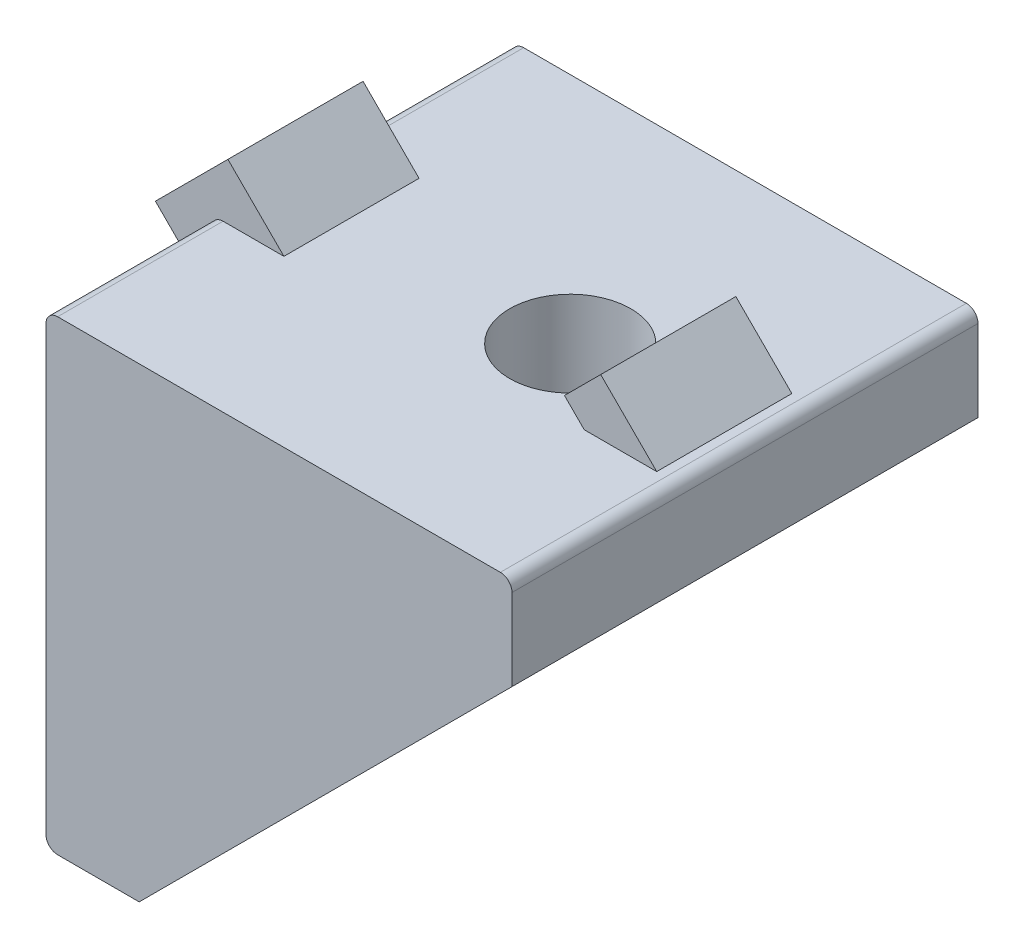
ISO-10303-21;
HEADER;
FILE_DESCRIPTION(('STEP AP214'),'2;1');
FILE_NAME('part.step','',(''),(''),'','','');
FILE_SCHEMA(('AUTOMOTIVE_DESIGN { 1 0 10303 214 1 1 1 1 }'));
ENDSEC;
DATA;
#1=APPLICATION_CONTEXT('core data for automotive mechanical design processes');
#2=APPLICATION_PROTOCOL_DEFINITION('international standard','automotive_design',2000,#1);
#3=PRODUCT_CONTEXT('',#1,'mechanical');
#4=PRODUCT('Part','Part','',(#3));
#5=PRODUCT_RELATED_PRODUCT_CATEGORY('part','',(#4));
#6=PRODUCT_DEFINITION_FORMATION('','',#4);
#7=PRODUCT_DEFINITION_CONTEXT('part definition',#1,'design');
#8=PRODUCT_DEFINITION('design','',#6,#7);
#9=PRODUCT_DEFINITION_SHAPE('','',#8);
#10=(LENGTH_UNIT() NAMED_UNIT(*) SI_UNIT(.MILLI.,.METRE.));
#11=(NAMED_UNIT(*) PLANE_ANGLE_UNIT() SI_UNIT($,.RADIAN.));
#12=(NAMED_UNIT(*) SI_UNIT($,.STERADIAN.) SOLID_ANGLE_UNIT());
#13=UNCERTAINTY_MEASURE_WITH_UNIT(LENGTH_MEASURE(1.E-05),#10,'distance_accuracy_value','');
#14=(GEOMETRIC_REPRESENTATION_CONTEXT(3) GLOBAL_UNCERTAINTY_ASSIGNED_CONTEXT((#13)) GLOBAL_UNIT_ASSIGNED_CONTEXT((#10,
#11,#12)) REPRESENTATION_CONTEXT('',''));
#15=CARTESIAN_POINT('',(0.,0.,0.));
#16=DIRECTION('',(0.,0.,1.));
#17=DIRECTION('',(1.,0.,0.));
#18=AXIS2_PLACEMENT_3D('',#15,#16,#17);
#19=CARTESIAN_POINT('',(-3.99999999999999,-16.,10.));
#20=DIRECTION('',(1.,0.,0.));
#21=DIRECTION('',(0.,1.,0.));
#22=AXIS2_PLACEMENT_3D('',#19,#20,#21);
#23=PLANE('',#22);
#24=DIRECTION('',(0.,-1.,0.));
#25=VECTOR('',#24,1.);
#26=CARTESIAN_POINT('',(-3.99999999999999,-16.,-10.));
#27=LINE('',#26,#25);
#28=CARTESIAN_POINT('',(-3.99999999999999,3.5,-10.));
#29=VERTEX_POINT('',#28);
#30=CARTESIAN_POINT('',(-3.99999999999999,-15.5,-10.));
#31=VERTEX_POINT('',#30);
#32=EDGE_CURVE('E366',#29,#31,#27,.T.);
#33=ORIENTED_EDGE('',*,*,#32,.T.);
#34=DIRECTION('',(0.,0.,-1.));
#35=VECTOR('',#34,1.);
#36=CARTESIAN_POINT('',(-3.99999999999999,-15.5,10.));
#37=LINE('',#36,#35);
#38=CARTESIAN_POINT('',(-3.99999999999999,-15.5,10.));
#39=VERTEX_POINT('',#38);
#40=EDGE_CURVE('E399',#31,#39,#37,.F.);
#41=ORIENTED_EDGE('',*,*,#40,.T.);
#42=DIRECTION('',(0.,-1.,0.));
#43=VECTOR('',#42,1.);
#44=CARTESIAN_POINT('',(-3.99999999999999,-16.,10.));
#45=LINE('',#44,#43);
#46=CARTESIAN_POINT('',(-3.99999999999999,3.5,10.));
#47=VERTEX_POINT('',#46);
#48=EDGE_CURVE('E355',#47,#39,#45,.T.);
#49=ORIENTED_EDGE('',*,*,#48,.F.);
#50=DIRECTION('',(0.,0.,-1.));
#51=VECTOR('',#50,1.);
#52=CARTESIAN_POINT('',(-3.99999999999999,3.5,10.));
#53=LINE('',#52,#51);
#54=CARTESIAN_POINT('',(-3.99999999999999,3.5,2.9));
#55=VERTEX_POINT('',#54);
#56=EDGE_CURVE('E393',#47,#55,#53,.T.);
#57=ORIENTED_EDGE('',*,*,#56,.T.);
#58=DIRECTION('',(0.,1.,0.));
#59=VECTOR('',#58,1.);
#60=CARTESIAN_POINT('',(-3.99999999999999,0.888730162779209,2.9));
#61=LINE('',#60,#59);
#62=CARTESIAN_POINT('',(-3.99999999999999,0.888730162779211,2.9));
#63=VERTEX_POINT('',#62);
#64=EDGE_CURVE('E295',#63,#55,#61,.T.);
#65=ORIENTED_EDGE('',*,*,#64,.F.);
#66=DIRECTION('',(0.,0.,-1.));
#67=VECTOR('',#66,1.);
#68=CARTESIAN_POINT('',(-3.99999999999999,0.888730162779209,2.9));
#69=LINE('',#68,#67);
#70=CARTESIAN_POINT('',(-3.99999999999999,0.888730162779209,-2.9));
#71=VERTEX_POINT('',#70);
#72=EDGE_CURVE('E298',#63,#71,#69,.T.);
#73=ORIENTED_EDGE('',*,*,#72,.T.);
#74=DIRECTION('',(0.,1.,0.));
#75=VECTOR('',#74,1.);
#76=CARTESIAN_POINT('',(-3.99999999999999,0.888730162779209,-2.9));
#77=LINE('',#76,#75);
#78=CARTESIAN_POINT('',(-3.99999999999999,3.5,-2.9));
#79=VERTEX_POINT('',#78);
#80=EDGE_CURVE('E288',#71,#79,#77,.T.);
#81=ORIENTED_EDGE('',*,*,#80,.T.);
#82=DIRECTION('',(0.,0.,-1.));
#83=VECTOR('',#82,1.);
#84=CARTESIAN_POINT('',(-3.99999999999999,3.5,10.));
#85=LINE('',#84,#83);
#86=EDGE_CURVE('E396',#79,#29,#85,.T.);
#87=ORIENTED_EDGE('',*,*,#86,.T.);
#88=EDGE_LOOP('',(#33,#41,#49,#57,#65,#73,#81,#87));
#89=FACE_BOUND('',#88,.T.);
#90=CARTESIAN_POINT('',(-3.99999999999999,-8.5,0.));
#91=DIRECTION('',(1.,0.,0.));
#92=DIRECTION('',(0.,0.,-1.));
#93=AXIS2_PLACEMENT_3D('',#90,#91,#92);
#94=CIRCLE('',#93,2.6);
#95=CARTESIAN_POINT('',(-3.99999999999999,-8.5,-2.6));
#96=VERTEX_POINT('',#95);
#97=EDGE_CURVE('E326',#96,#96,#94,.T.);
#98=ORIENTED_EDGE('',*,*,#97,.T.);
#99=EDGE_LOOP('',(#98));
#100=FACE_BOUND('',#99,.T.);
#101=DIRECTION('',(0.,1.,0.));
#102=VECTOR('',#101,1.);
#103=CARTESIAN_POINT('',(-3.99999999999999,-16.,2.9));
#104=LINE('',#103,#102);
#105=CARTESIAN_POINT('',(-3.99999999999999,-15.1112698372206,2.9));
#106=VERTEX_POINT('',#105);
#107=CARTESIAN_POINT('',(-3.99999999999999,-11.9999999999998,2.9));
#108=VERTEX_POINT('',#107);
#109=EDGE_CURVE('E254',#106,#108,#104,.T.);
#110=ORIENTED_EDGE('',*,*,#109,.F.);
#111=DIRECTION('',(0.,0.,1.));
#112=VECTOR('',#111,1.);
#113=CARTESIAN_POINT('',(-3.99999999999999,-15.1112698372206,10.));
#114=LINE('',#113,#112);
#115=CARTESIAN_POINT('',(-3.99999999999999,-15.1112698372206,-2.9));
#116=VERTEX_POINT('',#115);
#117=EDGE_CURVE('E233',#116,#106,#114,.T.);
#118=ORIENTED_EDGE('',*,*,#117,.F.);
#119=DIRECTION('',(0.,1.,0.));
#120=VECTOR('',#119,1.);
#121=CARTESIAN_POINT('',(-3.99999999999999,-16.,-2.9));
#122=LINE('',#121,#120);
#123=CARTESIAN_POINT('',(-3.99999999999999,-11.9999999999998,-2.9));
#124=VERTEX_POINT('',#123);
#125=EDGE_CURVE('E250',#116,#124,#122,.T.);
#126=ORIENTED_EDGE('',*,*,#125,.T.);
#127=DIRECTION('',(0.,0.,-1.));
#128=VECTOR('',#127,1.);
#129=CARTESIAN_POINT('',(-3.99999999999999,-11.9999999999998,10.));
#130=LINE('',#129,#128);
#131=EDGE_CURVE('E260',#108,#124,#130,.T.);
#132=ORIENTED_EDGE('',*,*,#131,.F.);
#133=EDGE_LOOP('',(#110,#118,#126,#132));
#134=FACE_BOUND('',#133,.T.);
#135=ADVANCED_FACE('F36',(#89,#100,#134),#23,.F.);
#136=CARTESIAN_POINT('',(-3.99999999999999,4.,10.));
#137=DIRECTION('',(0.,-1.,0.));
#138=DIRECTION('',(1.,0.,0.));
#139=AXIS2_PLACEMENT_3D('',#136,#137,#138);
#140=PLANE('',#139);
#141=DIRECTION('',(-1.,0.,0.));
#142=VECTOR('',#141,1.);
#143=CARTESIAN_POINT('',(-3.99999999999999,4.,10.));
#144=LINE('',#143,#142);
#145=CARTESIAN_POINT('',(15.5,4.,10.));
#146=VERTEX_POINT('',#145);
#147=CARTESIAN_POINT('',(-3.49999999999999,4.,10.));
#148=VERTEX_POINT('',#147);
#149=EDGE_CURVE('E351',#146,#148,#144,.T.);
#150=ORIENTED_EDGE('',*,*,#149,.F.);
#151=DIRECTION('',(0.,0.,-1.));
#152=VECTOR('',#151,1.);
#153=CARTESIAN_POINT('',(15.5,4.,10.));
#154=LINE('',#153,#152);
#155=CARTESIAN_POINT('',(15.5,4.,-10.));
#156=VERTEX_POINT('',#155);
#157=EDGE_CURVE('E411',#146,#156,#154,.T.);
#158=ORIENTED_EDGE('',*,*,#157,.T.);
#159=DIRECTION('',(-1.,0.,0.));
#160=VECTOR('',#159,1.);
#161=CARTESIAN_POINT('',(-3.99999999999999,4.,-10.));
#162=LINE('',#161,#160);
#163=CARTESIAN_POINT('',(-3.49999999999999,4.,-10.));
#164=VERTEX_POINT('',#163);
#165=EDGE_CURVE('E363',#156,#164,#162,.T.);
#166=ORIENTED_EDGE('',*,*,#165,.T.);
#167=DIRECTION('',(0.,0.,-1.));
#168=VECTOR('',#167,1.);
#169=CARTESIAN_POINT('',(-3.49999999999999,4.,10.));
#170=LINE('',#169,#168);
#171=CARTESIAN_POINT('',(-3.49999999999999,4.,-2.9));
#172=VERTEX_POINT('',#171);
#173=EDGE_CURVE('E409',#164,#172,#170,.F.);
#174=ORIENTED_EDGE('',*,*,#173,.T.);
#175=DIRECTION('',(1.,0.,0.));
#176=VECTOR('',#175,1.);
#177=CARTESIAN_POINT('',(-3.99999999999999,4.,-2.9));
#178=LINE('',#177,#176);
#179=CARTESIAN_POINT('',(-0.888730162779173,4.,-2.9));
#180=VERTEX_POINT('',#179);
#181=EDGE_CURVE('E284',#172,#180,#178,.T.);
#182=ORIENTED_EDGE('',*,*,#181,.T.);
#183=DIRECTION('',(0.,0.,-1.));
#184=VECTOR('',#183,1.);
#185=CARTESIAN_POINT('',(-0.888730162779173,4.,2.9));
#186=LINE('',#185,#184);
#187=CARTESIAN_POINT('',(-0.888730162779169,4.,2.9));
#188=VERTEX_POINT('',#187);
#189=EDGE_CURVE('E316',#188,#180,#186,.T.);
#190=ORIENTED_EDGE('',*,*,#189,.F.);
#191=DIRECTION('',(1.,0.,0.));
#192=VECTOR('',#191,1.);
#193=CARTESIAN_POINT('',(-3.99999999999999,4.,2.9));
#194=LINE('',#193,#192);
#195=CARTESIAN_POINT('',(-3.49999999999999,4.,2.9));
#196=VERTEX_POINT('',#195);
#197=EDGE_CURVE('E285',#196,#188,#194,.T.);
#198=ORIENTED_EDGE('',*,*,#197,.F.);
#199=DIRECTION('',(0.,0.,-1.));
#200=VECTOR('',#199,1.);
#201=CARTESIAN_POINT('',(-3.49999999999999,4.,10.));
#202=LINE('',#201,#200);
#203=EDGE_CURVE('E407',#196,#148,#202,.F.);
#204=ORIENTED_EDGE('',*,*,#203,.T.);
#205=EDGE_LOOP('',(#150,#158,#166,#174,#182,#190,#198,#204));
#206=FACE_BOUND('',#205,.T.);
#207=CARTESIAN_POINT('',(8.50000000000001,4.00000000000001,0.));
#208=DIRECTION('',(0.,-1.,0.));
#209=DIRECTION('',(1.,0.,0.));
#210=AXIS2_PLACEMENT_3D('',#207,#208,#209);
#211=CIRCLE('',#210,2.6);
#212=CARTESIAN_POINT('',(11.1,4.00000000000001,0.));
#213=VERTEX_POINT('',#212);
#214=EDGE_CURVE('E320',#213,#213,#211,.T.);
#215=ORIENTED_EDGE('',*,*,#214,.T.);
#216=EDGE_LOOP('',(#215));
#217=FACE_BOUND('',#216,.T.);
#218=DIRECTION('',(1.,0.,0.));
#219=VECTOR('',#218,1.);
#220=CARTESIAN_POINT('',(-3.99999999999999,4.,2.9));
#221=LINE('',#220,#219);
#222=CARTESIAN_POINT('',(12.,4.,2.9));
#223=VERTEX_POINT('',#222);
#224=CARTESIAN_POINT('',(15.1112698372208,4.00000000000001,2.9));
#225=VERTEX_POINT('',#224);
#226=EDGE_CURVE('E382',#223,#225,#221,.T.);
#227=ORIENTED_EDGE('',*,*,#226,.F.);
#228=DIRECTION('',(0.,0.,1.));
#229=VECTOR('',#228,1.);
#230=CARTESIAN_POINT('',(12.,4.,10.));
#231=LINE('',#230,#229);
#232=CARTESIAN_POINT('',(12.,4.,-2.9));
#233=VERTEX_POINT('',#232);
#234=EDGE_CURVE('E380',#233,#223,#231,.T.);
#235=ORIENTED_EDGE('',*,*,#234,.F.);
#236=DIRECTION('',(1.,0.,0.));
#237=VECTOR('',#236,1.);
#238=CARTESIAN_POINT('',(-3.99999999999999,4.,-2.9));
#239=LINE('',#238,#237);
#240=CARTESIAN_POINT('',(15.1112698372208,4.00000000000001,-2.9));
#241=VERTEX_POINT('',#240);
#242=EDGE_CURVE('E374',#233,#241,#239,.T.);
#243=ORIENTED_EDGE('',*,*,#242,.T.);
#244=DIRECTION('',(0.,0.,-1.));
#245=VECTOR('',#244,1.);
#246=CARTESIAN_POINT('',(15.1112698372208,4.,10.));
#247=LINE('',#246,#245);
#248=EDGE_CURVE('E377',#225,#241,#247,.T.);
#249=ORIENTED_EDGE('',*,*,#248,.F.);
#250=EDGE_LOOP('',(#227,#235,#243,#249));
#251=FACE_BOUND('',#250,.T.);
#252=ADVANCED_FACE('F479',(#206,#217,#251),#140,.F.);
#253=CARTESIAN_POINT('',(16.,0.,10.));
#254=DIRECTION('',(0.,1.,0.));
#255=DIRECTION('',(-1.,0.,0.));
#256=AXIS2_PLACEMENT_3D('',#253,#254,#255);
#257=PLANE('',#256);
#258=CARTESIAN_POINT('',(8.50000000000001,0.,0.));
#259=DIRECTION('',(0.,-1.,0.));
#260=DIRECTION('',(1.,0.,0.));
#261=AXIS2_PLACEMENT_3D('',#258,#259,#260);
#262=CIRCLE('',#261,2.6);
#263=CARTESIAN_POINT('',(11.1,0.,0.));
#264=VERTEX_POINT('',#263);
#265=EDGE_CURVE('E319',#264,#264,#262,.T.);
#266=ORIENTED_EDGE('',*,*,#265,.F.);
#267=EDGE_LOOP('',(#266));
#268=FACE_BOUND('',#267,.T.);
#269=DIRECTION('',(0.,0.,-1.));
#270=VECTOR('',#269,1.);
#271=CARTESIAN_POINT('',(16.,0.,10.));
#272=LINE('',#271,#270);
#273=CARTESIAN_POINT('',(16.,0.,6.00000000000001));
#274=VERTEX_POINT('',#273);
#275=CARTESIAN_POINT('',(16.,0.,-6.00000000000001));
#276=VERTEX_POINT('',#275);
#277=EDGE_CURVE('E372',#274,#276,#272,.T.);
#278=ORIENTED_EDGE('',*,*,#277,.F.);
#279=DIRECTION('',(-1.,0.,0.));
#280=VECTOR('',#279,1.);
#281=CARTESIAN_POINT('',(16.,0.,6.00000000000001));
#282=LINE('',#281,#280);
#283=CARTESIAN_POINT('',(0.999999999999994,0.,6.00000000000001));
#284=VERTEX_POINT('',#283);
#285=EDGE_CURVE('E441',#274,#284,#282,.T.);
#286=ORIENTED_EDGE('',*,*,#285,.T.);
#287=DIRECTION('',(0.,0.,-1.));
#288=VECTOR('',#287,1.);
#289=CARTESIAN_POINT('',(0.999999999999994,0.,-7.));
#290=LINE('',#289,#288);
#291=CARTESIAN_POINT('',(0.999999999999994,0.,-6.00000000000001));
#292=VERTEX_POINT('',#291);
#293=EDGE_CURVE('E439',#284,#292,#290,.T.);
#294=ORIENTED_EDGE('',*,*,#293,.T.);
#295=DIRECTION('',(1.,0.,0.));
#296=VECTOR('',#295,1.);
#297=CARTESIAN_POINT('',(16.,0.,-6.00000000000001));
#298=LINE('',#297,#296);
#299=EDGE_CURVE('E436',#292,#276,#298,.T.);
#300=ORIENTED_EDGE('',*,*,#299,.T.);
#301=EDGE_LOOP('',(#278,#286,#294,#300));
#302=FACE_BOUND('',#301,.T.);
#303=ADVANCED_FACE('F485',(#268,#302),#257,.F.);
#304=CARTESIAN_POINT('',(16.,4.,10.));
#305=DIRECTION('',(-1.,0.,0.));
#306=DIRECTION('',(0.,0.,1.));
#307=AXIS2_PLACEMENT_3D('',#304,#305,#306);
#308=PLANE('',#307);
#309=DIRECTION('',(0.,1.,0.));
#310=VECTOR('',#309,1.);
#311=CARTESIAN_POINT('',(16.,4.,-10.));
#312=LINE('',#311,#310);
#313=CARTESIAN_POINT('',(16.,0.,-10.));
#314=VERTEX_POINT('',#313);
#315=CARTESIAN_POINT('',(16.,3.5,-10.));
#316=VERTEX_POINT('',#315);
#317=EDGE_CURVE('E346',#314,#316,#312,.T.);
#318=ORIENTED_EDGE('',*,*,#317,.T.);
#319=DIRECTION('',(0.,0.,-1.));
#320=VECTOR('',#319,1.);
#321=CARTESIAN_POINT('',(16.,3.5,10.));
#322=LINE('',#321,#320);
#323=CARTESIAN_POINT('',(16.,3.5,10.));
#324=VERTEX_POINT('',#323);
#325=EDGE_CURVE('E414',#316,#324,#322,.F.);
#326=ORIENTED_EDGE('',*,*,#325,.T.);
#327=DIRECTION('',(0.,1.,0.));
#328=VECTOR('',#327,1.);
#329=CARTESIAN_POINT('',(16.,4.,10.));
#330=LINE('',#329,#328);
#331=CARTESIAN_POINT('',(16.,0.,10.));
#332=VERTEX_POINT('',#331);
#333=EDGE_CURVE('E348',#332,#324,#330,.T.);
#334=ORIENTED_EDGE('',*,*,#333,.F.);
#335=EDGE_CURVE('E54',#332,#274,#272,.T.);
#336=ORIENTED_EDGE('',*,*,#335,.T.);
#337=ORIENTED_EDGE('',*,*,#277,.T.);
#338=DIRECTION('',(0.,0.,-1.));
#339=VECTOR('',#338,1.);
#340=CARTESIAN_POINT('',(16.,0.,-7.));
#341=LINE('',#340,#339);
#342=EDGE_CURVE('E338',#276,#314,#341,.T.);
#343=ORIENTED_EDGE('',*,*,#342,.T.);
#344=EDGE_LOOP('',(#318,#326,#334,#336,#337,#343));
#345=FACE_BOUND('',#344,.T.);
#346=ADVANCED_FACE('F493',(#345),#308,.F.);
#347=CARTESIAN_POINT('',(0.,-16.,10.));
#348=DIRECTION('',(0.,1.,0.));
#349=DIRECTION('',(0.,0.,1.));
#350=AXIS2_PLACEMENT_3D('',#347,#348,#349);
#351=PLANE('',#350);
#352=DIRECTION('',(1.,0.,0.));
#353=VECTOR('',#352,1.);
#354=CARTESIAN_POINT('',(0.,-16.,10.));
#355=LINE('',#354,#353);
#356=CARTESIAN_POINT('',(-3.49999999999999,-16.,10.));
#357=VERTEX_POINT('',#356);
#358=CARTESIAN_POINT('',(0.,-16.,10.));
#359=VERTEX_POINT('',#358);
#360=EDGE_CURVE('E358',#357,#359,#355,.T.);
#361=ORIENTED_EDGE('',*,*,#360,.F.);
#362=DIRECTION('',(0.,0.,-1.));
#363=VECTOR('',#362,1.);
#364=CARTESIAN_POINT('',(-3.49999999999999,-16.,10.));
#365=LINE('',#364,#363);
#366=CARTESIAN_POINT('',(-3.49999999999999,-16.,-10.));
#367=VERTEX_POINT('',#366);
#368=EDGE_CURVE('E384',#357,#367,#365,.T.);
#369=ORIENTED_EDGE('',*,*,#368,.T.);
#370=DIRECTION('',(1.,0.,0.));
#371=VECTOR('',#370,1.);
#372=CARTESIAN_POINT('',(0.,-16.,-10.));
#373=LINE('',#372,#371);
#374=CARTESIAN_POINT('',(0.,-16.,-10.));
#375=VERTEX_POINT('',#374);
#376=EDGE_CURVE('E352',#367,#375,#373,.T.);
#377=ORIENTED_EDGE('',*,*,#376,.T.);
#378=DIRECTION('',(0.,0.,-1.));
#379=VECTOR('',#378,1.);
#380=CARTESIAN_POINT('',(0.,-16.,-7.));
#381=LINE('',#380,#379);
#382=CARTESIAN_POINT('',(0.,-16.,-6.00000000000001));
#383=VERTEX_POINT('',#382);
#384=EDGE_CURVE('E335',#383,#375,#381,.T.);
#385=ORIENTED_EDGE('',*,*,#384,.F.);
#386=DIRECTION('',(0.,0.,-1.));
#387=VECTOR('',#386,1.);
#388=CARTESIAN_POINT('',(0.,-16.,10.));
#389=LINE('',#388,#387);
#390=CARTESIAN_POINT('',(0.,-16.,6.));
#391=VERTEX_POINT('',#390);
#392=EDGE_CURVE('E360',#391,#383,#389,.T.);
#393=ORIENTED_EDGE('',*,*,#392,.F.);
#394=EDGE_CURVE('E370',#359,#391,#389,.T.);
#395=ORIENTED_EDGE('',*,*,#394,.F.);
#396=EDGE_LOOP('',(#361,#369,#377,#385,#393,#395));
#397=FACE_BOUND('',#396,.T.);
#398=ADVANCED_FACE('F490',(#397),#351,.F.);
#399=CARTESIAN_POINT('',(0.,0.,10.));
#400=DIRECTION('',(-1.,0.,0.));
#401=DIRECTION('',(0.,-1.,0.));
#402=AXIS2_PLACEMENT_3D('',#399,#400,#401);
#403=PLANE('',#402);
#404=ORIENTED_EDGE('',*,*,#392,.T.);
#405=DIRECTION('',(0.,1.,0.));
#406=VECTOR('',#405,1.);
#407=CARTESIAN_POINT('',(0.,0.,-6.00000000000001));
#408=LINE('',#407,#406);
#409=CARTESIAN_POINT('',(0.,-1.,-6.00000000000001));
#410=VERTEX_POINT('',#409);
#411=EDGE_CURVE('E430',#383,#410,#408,.T.);
#412=ORIENTED_EDGE('',*,*,#411,.T.);
#413=DIRECTION('',(0.,0.,1.));
#414=VECTOR('',#413,1.);
#415=CARTESIAN_POINT('',(0.,-1.,7.));
#416=LINE('',#415,#414);
#417=CARTESIAN_POINT('',(0.,-1.,6.));
#418=VERTEX_POINT('',#417);
#419=EDGE_CURVE('E425',#410,#418,#416,.T.);
#420=ORIENTED_EDGE('',*,*,#419,.T.);
#421=DIRECTION('',(0.,-1.,0.));
#422=VECTOR('',#421,1.);
#423=CARTESIAN_POINT('',(0.,0.,6.));
#424=LINE('',#423,#422);
#425=EDGE_CURVE('E427',#418,#391,#424,.T.);
#426=ORIENTED_EDGE('',*,*,#425,.T.);
#427=EDGE_LOOP('',(#404,#412,#420,#426));
#428=FACE_BOUND('',#427,.T.);
#429=CARTESIAN_POINT('',(0.,-8.5,0.));
#430=DIRECTION('',(1.,0.,0.));
#431=DIRECTION('',(0.,0.,-1.));
#432=AXIS2_PLACEMENT_3D('',#429,#430,#431);
#433=CIRCLE('',#432,2.6);
#434=CARTESIAN_POINT('',(0.,-8.5,-2.6));
#435=VERTEX_POINT('',#434);
#436=EDGE_CURVE('E323',#435,#435,#433,.T.);
#437=ORIENTED_EDGE('',*,*,#436,.F.);
#438=EDGE_LOOP('',(#437));
#439=FACE_BOUND('',#438,.T.);
#440=ADVANCED_FACE('F555',(#428,#439),#403,.F.);
#441=CARTESIAN_POINT('',(0.,0.,10.));
#442=DIRECTION('',(0.,0.,1.));
#443=DIRECTION('',(1.,0.,0.));
#444=AXIS2_PLACEMENT_3D('',#441,#442,#443);
#445=PLANE('',#444);
#446=ORIENTED_EDGE('',*,*,#48,.T.);
#447=CARTESIAN_POINT('',(-3.49999999999999,-15.5,10.));
#448=DIRECTION('',(0.,0.,1.));
#449=DIRECTION('',(1.,0.,0.));
#450=AXIS2_PLACEMENT_3D('',#447,#448,#449);
#451=CIRCLE('',#450,0.5);
#452=EDGE_CURVE('E405',#39,#357,#451,.T.);
#453=ORIENTED_EDGE('',*,*,#452,.T.);
#454=ORIENTED_EDGE('',*,*,#360,.T.);
#455=DIRECTION('',(0.707106781186548,0.707106781186548,0.));
#456=VECTOR('',#455,1.);
#457=CARTESIAN_POINT('',(0.,-16.,10.));
#458=LINE('',#457,#456);
#459=EDGE_CURVE('E340',#359,#332,#458,.T.);
#460=ORIENTED_EDGE('',*,*,#459,.T.);
#461=ORIENTED_EDGE('',*,*,#333,.T.);
#462=CARTESIAN_POINT('',(15.5,3.5,10.));
#463=DIRECTION('',(0.,0.,1.));
#464=DIRECTION('',(1.,0.,0.));
#465=AXIS2_PLACEMENT_3D('',#462,#463,#464);
#466=CIRCLE('',#465,0.5);
#467=EDGE_CURVE('E403',#324,#146,#466,.T.);
#468=ORIENTED_EDGE('',*,*,#467,.T.);
#469=ORIENTED_EDGE('',*,*,#149,.T.);
#470=CARTESIAN_POINT('',(-3.49999999999999,3.5,10.));
#471=DIRECTION('',(0.,0.,1.));
#472=DIRECTION('',(1.,0.,0.));
#473=AXIS2_PLACEMENT_3D('',#470,#471,#472);
#474=CIRCLE('',#473,0.5);
#475=EDGE_CURVE('E401',#148,#47,#474,.T.);
#476=ORIENTED_EDGE('',*,*,#475,.T.);
#477=EDGE_LOOP('',(#446,#453,#454,#460,#461,#468,#469,#476));
#478=FACE_BOUND('',#477,.T.);
#479=ADVANCED_FACE('F577',(#478),#445,.T.);
#480=CARTESIAN_POINT('',(0.,0.,-10.));
#481=DIRECTION('',(0.,0.,1.));
#482=DIRECTION('',(1.,0.,0.));
#483=AXIS2_PLACEMENT_3D('',#480,#481,#482);
#484=PLANE('',#483);
#485=ORIENTED_EDGE('',*,*,#376,.F.);
#486=CARTESIAN_POINT('',(-3.49999999999999,-15.5,-10.));
#487=DIRECTION('',(0.,0.,1.));
#488=DIRECTION('',(1.,0.,0.));
#489=AXIS2_PLACEMENT_3D('',#486,#487,#488);
#490=CIRCLE('',#489,0.5);
#491=EDGE_CURVE('E391',#367,#31,#490,.F.);
#492=ORIENTED_EDGE('',*,*,#491,.T.);
#493=ORIENTED_EDGE('',*,*,#32,.F.);
#494=CARTESIAN_POINT('',(-3.49999999999999,3.5,-10.));
#495=DIRECTION('',(0.,0.,1.));
#496=DIRECTION('',(1.,0.,0.));
#497=AXIS2_PLACEMENT_3D('',#494,#495,#496);
#498=CIRCLE('',#497,0.5);
#499=EDGE_CURVE('E387',#29,#164,#498,.F.);
#500=ORIENTED_EDGE('',*,*,#499,.T.);
#501=ORIENTED_EDGE('',*,*,#165,.F.);
#502=CARTESIAN_POINT('',(15.5,3.5,-10.));
#503=DIRECTION('',(0.,0.,1.));
#504=DIRECTION('',(1.,0.,0.));
#505=AXIS2_PLACEMENT_3D('',#502,#503,#504);
#506=CIRCLE('',#505,0.5);
#507=EDGE_CURVE('E389',#156,#316,#506,.F.);
#508=ORIENTED_EDGE('',*,*,#507,.T.);
#509=ORIENTED_EDGE('',*,*,#317,.F.);
#510=DIRECTION('',(0.707106781186548,0.707106781186548,0.));
#511=VECTOR('',#510,1.);
#512=CARTESIAN_POINT('',(0.,-16.,-10.));
#513=LINE('',#512,#511);
#514=EDGE_CURVE('E329',#375,#314,#513,.T.);
#515=ORIENTED_EDGE('',*,*,#514,.F.);
#516=EDGE_LOOP('',(#485,#492,#493,#500,#501,#508,#509,#515));
#517=FACE_BOUND('',#516,.T.);
#518=ADVANCED_FACE('F570',(#517),#484,.F.);
#519=CARTESIAN_POINT('',(0.,-16.,7.));
#520=DIRECTION('',(0.707106781186548,-0.707106781186547,0.));
#521=DIRECTION('',(0.707106781186547,0.707106781186548,0.));
#522=AXIS2_PLACEMENT_3D('',#519,#520,#521);
#523=PLANE('',#522);
#524=ORIENTED_EDGE('',*,*,#459,.F.);
#525=ORIENTED_EDGE('',*,*,#394,.T.);
#526=DIRECTION('',(0.577350269189624,0.577350269189624,0.57735026918963));
#527=VECTOR('',#526,1.);
#528=CARTESIAN_POINT('',(5.3333333333333,-10.6666666666667,11.3333333333333));
#529=LINE('',#528,#527);
#530=CARTESIAN_POINT('',(1.,-15.,7.));
#531=VERTEX_POINT('',#530);
#532=EDGE_CURVE('E446',#391,#531,#529,.T.);
#533=ORIENTED_EDGE('',*,*,#532,.T.);
#534=DIRECTION('',(0.707106781186548,0.707106781186548,0.));
#535=VECTOR('',#534,1.);
#536=CARTESIAN_POINT('',(0.,-16.,7.));
#537=LINE('',#536,#535);
#538=CARTESIAN_POINT('',(15.,-0.999999999999997,7.));
#539=VERTEX_POINT('',#538);
#540=EDGE_CURVE('E343',#531,#539,#537,.T.);
#541=ORIENTED_EDGE('',*,*,#540,.T.);
#542=DIRECTION('',(0.577350269189628,0.577350269189628,-0.577350269189622));
#543=VECTOR('',#542,1.);
#544=CARTESIAN_POINT('',(16.,0.,6.00000000000001));
#545=LINE('',#544,#543);
#546=EDGE_CURVE('E46',#539,#274,#545,.T.);
#547=ORIENTED_EDGE('',*,*,#546,.T.);
#548=ORIENTED_EDGE('',*,*,#335,.F.);
#549=EDGE_LOOP('',(#524,#525,#533,#541,#547,#548));
#550=FACE_BOUND('',#549,.T.);
#551=ADVANCED_FACE('F545',(#550),#523,.T.);
#552=CARTESIAN_POINT('',(0.,0.,7.));
#553=DIRECTION('',(0.,0.,-1.));
#554=DIRECTION('',(-1.,0.,0.));
#555=AXIS2_PLACEMENT_3D('',#552,#553,#554);
#556=PLANE('',#555);
#557=ORIENTED_EDGE('',*,*,#540,.F.);
#558=DIRECTION('',(0.,1.,0.));
#559=VECTOR('',#558,1.);
#560=CARTESIAN_POINT('',(0.999999999999994,0.,7.));
#561=LINE('',#560,#559);
#562=CARTESIAN_POINT('',(0.999999999999994,-1.,7.));
#563=VERTEX_POINT('',#562);
#564=EDGE_CURVE('E434',#531,#563,#561,.T.);
#565=ORIENTED_EDGE('',*,*,#564,.T.);
#566=DIRECTION('',(1.,0.,0.));
#567=VECTOR('',#566,1.);
#568=CARTESIAN_POINT('',(0.,-1.,7.));
#569=LINE('',#568,#567);
#570=EDGE_CURVE('E432',#563,#539,#569,.T.);
#571=ORIENTED_EDGE('',*,*,#570,.T.);
#572=EDGE_LOOP('',(#557,#565,#571));
#573=FACE_BOUND('',#572,.T.);
#574=ADVANCED_FACE('F550',(#573),#556,.T.);
#575=CARTESIAN_POINT('',(0.,-16.,-7.));
#576=DIRECTION('',(-0.707106781186548,0.707106781186547,0.));
#577=DIRECTION('',(-0.707106781186547,-0.707106781186548,0.));
#578=AXIS2_PLACEMENT_3D('',#575,#576,#577);
#579=PLANE('',#578);
#580=ORIENTED_EDGE('',*,*,#514,.T.);
#581=ORIENTED_EDGE('',*,*,#342,.F.);
#582=DIRECTION('',(-0.577350269189628,-0.577350269189628,-0.577350269189621));
#583=VECTOR('',#582,1.);
#584=CARTESIAN_POINT('',(4.99999999999993,-11.0000000000001,-17.));
#585=LINE('',#584,#583);
#586=CARTESIAN_POINT('',(15.,-0.999999999999997,-7.));
#587=VERTEX_POINT('',#586);
#588=EDGE_CURVE('E11',#276,#587,#585,.T.);
#589=ORIENTED_EDGE('',*,*,#588,.T.);
#590=DIRECTION('',(0.707106781186548,0.707106781186548,0.));
#591=VECTOR('',#590,1.);
#592=CARTESIAN_POINT('',(0.,-16.,-7.));
#593=LINE('',#592,#591);
#594=CARTESIAN_POINT('',(1.00000000000001,-15.,-7.));
#595=VERTEX_POINT('',#594);
#596=EDGE_CURVE('E332',#595,#587,#593,.T.);
#597=ORIENTED_EDGE('',*,*,#596,.F.);
#598=DIRECTION('',(-0.577350269189628,-0.577350269189628,0.577350269189622));
#599=VECTOR('',#598,1.);
#600=CARTESIAN_POINT('',(0.33333333333334,-15.6666666666667,-6.33333333333333));
#601=LINE('',#600,#599);
#602=EDGE_CURVE('E443',#595,#383,#601,.T.);
#603=ORIENTED_EDGE('',*,*,#602,.T.);
#604=ORIENTED_EDGE('',*,*,#384,.T.);
#605=EDGE_LOOP('',(#580,#581,#589,#597,#603,#604));
#606=FACE_BOUND('',#605,.T.);
#607=ADVANCED_FACE('F564',(#606),#579,.F.);
#608=CARTESIAN_POINT('',(0.,0.,-7.));
#609=DIRECTION('',(0.,0.,1.));
#610=DIRECTION('',(-1.,0.,0.));
#611=AXIS2_PLACEMENT_3D('',#608,#609,#610);
#612=PLANE('',#611);
#613=DIRECTION('',(-1.,0.,0.));
#614=VECTOR('',#613,1.);
#615=CARTESIAN_POINT('',(0.,-1.,-7.));
#616=LINE('',#615,#614);
#617=CARTESIAN_POINT('',(1.00000000000001,-1.,-7.));
#618=VERTEX_POINT('',#617);
#619=EDGE_CURVE('E420',#587,#618,#616,.T.);
#620=ORIENTED_EDGE('',*,*,#619,.T.);
#621=DIRECTION('',(0.,-1.,0.));
#622=VECTOR('',#621,1.);
#623=CARTESIAN_POINT('',(1.,0.,-7.));
#624=LINE('',#623,#622);
#625=EDGE_CURVE('E422',#618,#595,#624,.T.);
#626=ORIENTED_EDGE('',*,*,#625,.T.);
#627=ORIENTED_EDGE('',*,*,#596,.T.);
#628=EDGE_LOOP('',(#620,#626,#627));
#629=FACE_BOUND('',#628,.T.);
#630=ADVANCED_FACE('F636',(#629),#612,.T.);
#631=CARTESIAN_POINT('',(-3.99999999999999,-8.5,0.));
#632=DIRECTION('',(1.,0.,0.));
#633=DIRECTION('',(0.,0.,-1.));
#634=AXIS2_PLACEMENT_3D('',#631,#632,#633);
#635=CYLINDRICAL_SURFACE('',#634,2.6);
#636=ORIENTED_EDGE('',*,*,#97,.F.);
#637=EDGE_LOOP('',(#636));
#638=FACE_BOUND('',#637,.T.);
#639=ORIENTED_EDGE('',*,*,#436,.T.);
#640=EDGE_LOOP('',(#639));
#641=FACE_BOUND('',#640,.T.);
#642=ADVANCED_FACE('F632',(#638,#641),#635,.F.);
#643=CARTESIAN_POINT('',(8.50000000000001,4.00000000000001,0.));
#644=DIRECTION('',(0.,-1.,0.));
#645=DIRECTION('',(1.,0.,0.));
#646=AXIS2_PLACEMENT_3D('',#643,#644,#645);
#647=CYLINDRICAL_SURFACE('',#646,2.6);
#648=ORIENTED_EDGE('',*,*,#214,.F.);
#649=EDGE_LOOP('',(#648));
#650=FACE_BOUND('',#649,.T.);
#651=ORIENTED_EDGE('',*,*,#265,.T.);
#652=EDGE_LOOP('',(#651));
#653=FACE_BOUND('',#652,.T.);
#654=ADVANCED_FACE('F629',(#650,#653),#647,.F.);
#655=CARTESIAN_POINT('',(-0.888730162779173,4.,2.9));
#656=DIRECTION('',(-0.707106781186544,-0.707106781186552,0.));
#657=DIRECTION('',(0.707106781186552,-0.707106781186544,0.));
#658=AXIS2_PLACEMENT_3D('',#655,#656,#657);
#659=PLANE('',#658);
#660=DIRECTION('',(-0.707106781186552,0.707106781186544,0.));
#661=VECTOR('',#660,1.);
#662=CARTESIAN_POINT('',(-0.888730162779173,4.,-2.9));
#663=LINE('',#662,#661);
#664=CARTESIAN_POINT('',(-3.29289321881347,6.40416305603427,-2.9));
#665=VERTEX_POINT('',#664);
#666=EDGE_CURVE('E300',#180,#665,#663,.T.);
#667=ORIENTED_EDGE('',*,*,#666,.T.);
#668=DIRECTION('',(0.,0.,-1.));
#669=VECTOR('',#668,1.);
#670=CARTESIAN_POINT('',(-3.29289321881347,6.40416305603427,2.9));
#671=LINE('',#670,#669);
#672=CARTESIAN_POINT('',(-3.29289321881347,6.40416305603427,2.9));
#673=VERTEX_POINT('',#672);
#674=EDGE_CURVE('E313',#673,#665,#671,.T.);
#675=ORIENTED_EDGE('',*,*,#674,.F.);
#676=DIRECTION('',(-0.707106781186552,0.707106781186544,0.));
#677=VECTOR('',#676,1.);
#678=CARTESIAN_POINT('',(-0.888730162779173,4.,2.9));
#679=LINE('',#678,#677);
#680=EDGE_CURVE('E287',#188,#673,#679,.T.);
#681=ORIENTED_EDGE('',*,*,#680,.F.);
#682=ORIENTED_EDGE('',*,*,#189,.T.);
#683=EDGE_LOOP('',(#667,#675,#681,#682));
#684=FACE_BOUND('',#683,.T.);
#685=ADVANCED_FACE('F610',(#684),#659,.F.);
#686=CARTESIAN_POINT('',(-3.29289321881347,6.40416305603427,2.9));
#687=DIRECTION('',(0.707106781186552,-0.707106781186544,0.));
#688=DIRECTION('',(0.707106781186544,0.707106781186552,0.));
#689=AXIS2_PLACEMENT_3D('',#686,#687,#688);
#690=PLANE('',#689);
#691=DIRECTION('',(-0.707106781186544,-0.707106781186551,0.));
#692=VECTOR('',#691,1.);
#693=CARTESIAN_POINT('',(-3.29289321881347,6.40416305603427,-2.9));
#694=LINE('',#693,#692);
#695=CARTESIAN_POINT('',(-6.40416305603426,3.29289321881345,-2.9));
#696=VERTEX_POINT('',#695);
#697=EDGE_CURVE('E302',#665,#696,#694,.T.);
#698=ORIENTED_EDGE('',*,*,#697,.T.);
#699=DIRECTION('',(0.,0.,-1.));
#700=VECTOR('',#699,1.);
#701=CARTESIAN_POINT('',(-6.40416305603426,3.29289321881345,2.9));
#702=LINE('',#701,#700);
#703=CARTESIAN_POINT('',(-6.40416305603426,3.29289321881345,2.9));
#704=VERTEX_POINT('',#703);
#705=EDGE_CURVE('E310',#704,#696,#702,.T.);
#706=ORIENTED_EDGE('',*,*,#705,.F.);
#707=DIRECTION('',(-0.707106781186544,-0.707106781186551,0.));
#708=VECTOR('',#707,1.);
#709=CARTESIAN_POINT('',(-3.29289321881347,6.40416305603427,2.9));
#710=LINE('',#709,#708);
#711=EDGE_CURVE('E290',#673,#704,#710,.T.);
#712=ORIENTED_EDGE('',*,*,#711,.F.);
#713=ORIENTED_EDGE('',*,*,#674,.T.);
#714=EDGE_LOOP('',(#698,#706,#712,#713));
#715=FACE_BOUND('',#714,.T.);
#716=ADVANCED_FACE('F605',(#715),#690,.F.);
#717=CARTESIAN_POINT('',(-6.40416305603426,3.29289321881345,2.9));
#718=DIRECTION('',(0.707106781186544,0.707106781186551,0.));
#719=DIRECTION('',(-0.707106781186551,0.707106781186544,0.));
#720=AXIS2_PLACEMENT_3D('',#717,#718,#719);
#721=PLANE('',#720);
#722=DIRECTION('',(0.707106781186551,-0.707106781186544,0.));
#723=VECTOR('',#722,1.);
#724=CARTESIAN_POINT('',(-6.40416305603426,3.29289321881345,-2.9));
#725=LINE('',#724,#723);
#726=EDGE_CURVE('E304',#696,#71,#725,.T.);
#727=ORIENTED_EDGE('',*,*,#726,.T.);
#728=ORIENTED_EDGE('',*,*,#72,.F.);
#729=DIRECTION('',(0.707106781186551,-0.707106781186544,0.));
#730=VECTOR('',#729,1.);
#731=CARTESIAN_POINT('',(-6.40416305603426,3.29289321881345,2.9));
#732=LINE('',#731,#730);
#733=EDGE_CURVE('E292',#704,#63,#732,.T.);
#734=ORIENTED_EDGE('',*,*,#733,.F.);
#735=ORIENTED_EDGE('',*,*,#705,.T.);
#736=EDGE_LOOP('',(#727,#728,#734,#735));
#737=FACE_BOUND('',#736,.T.);
#738=ADVANCED_FACE('F601',(#737),#721,.F.);
#739=CARTESIAN_POINT('',(0.,0.,2.9));
#740=DIRECTION('',(0.,0.,1.));
#741=DIRECTION('',(1.,0.,0.));
#742=AXIS2_PLACEMENT_3D('',#739,#740,#741);
#743=PLANE('',#742);
#744=ORIENTED_EDGE('',*,*,#64,.T.);
#745=CARTESIAN_POINT('',(-3.49999999999999,3.5,2.9));
#746=DIRECTION('',(0.,0.,1.));
#747=DIRECTION('',(1.,0.,0.));
#748=AXIS2_PLACEMENT_3D('',#745,#746,#747);
#749=CIRCLE('',#748,0.5);
#750=EDGE_CURVE('E418',#55,#196,#749,.F.);
#751=ORIENTED_EDGE('',*,*,#750,.T.);
#752=ORIENTED_EDGE('',*,*,#197,.T.);
#753=ORIENTED_EDGE('',*,*,#680,.T.);
#754=ORIENTED_EDGE('',*,*,#711,.T.);
#755=ORIENTED_EDGE('',*,*,#733,.T.);
#756=EDGE_LOOP('',(#744,#751,#752,#753,#754,#755));
#757=FACE_BOUND('',#756,.T.);
#758=ADVANCED_FACE('F612',(#757),#743,.T.);
#759=CARTESIAN_POINT('',(0.,0.,-2.9));
#760=DIRECTION('',(0.,0.,1.));
#761=DIRECTION('',(1.,0.,0.));
#762=AXIS2_PLACEMENT_3D('',#759,#760,#761);
#763=PLANE('',#762);
#764=ORIENTED_EDGE('',*,*,#181,.F.);
#765=CARTESIAN_POINT('',(-3.49999999999999,3.5,-2.9));
#766=DIRECTION('',(0.,0.,1.));
#767=DIRECTION('',(1.,0.,0.));
#768=AXIS2_PLACEMENT_3D('',#765,#766,#767);
#769=CIRCLE('',#768,0.5);
#770=EDGE_CURVE('E416',#172,#79,#769,.T.);
#771=ORIENTED_EDGE('',*,*,#770,.T.);
#772=ORIENTED_EDGE('',*,*,#80,.F.);
#773=ORIENTED_EDGE('',*,*,#726,.F.);
#774=ORIENTED_EDGE('',*,*,#697,.F.);
#775=ORIENTED_EDGE('',*,*,#666,.F.);
#776=EDGE_LOOP('',(#764,#771,#772,#773,#774,#775));
#777=FACE_BOUND('',#776,.T.);
#778=ADVANCED_FACE('F595',(#777),#763,.F.);
#779=CARTESIAN_POINT('',(11.1514718625761,4.84852813742387,2.9));
#780=DIRECTION('',(0.707106781186548,0.707106781186547,0.));
#781=DIRECTION('',(-0.707106781186547,0.707106781186548,0.));
#782=AXIS2_PLACEMENT_3D('',#779,#780,#781);
#783=PLANE('',#782);
#784=DIRECTION('',(0.707106781186547,-0.707106781186548,0.));
#785=VECTOR('',#784,1.);
#786=CARTESIAN_POINT('',(11.1514718625761,4.84852813742387,-2.9));
#787=LINE('',#786,#785);
#788=CARTESIAN_POINT('',(11.1514718625761,4.84852813742387,-2.9));
#789=VERTEX_POINT('',#788);
#790=EDGE_CURVE('E264',#789,#233,#787,.T.);
#791=ORIENTED_EDGE('',*,*,#790,.T.);
#792=ORIENTED_EDGE('',*,*,#234,.T.);
#793=DIRECTION('',(0.707106781186547,-0.707106781186548,0.));
#794=VECTOR('',#793,1.);
#795=CARTESIAN_POINT('',(11.1514718625761,4.84852813742387,2.9));
#796=LINE('',#795,#794);
#797=CARTESIAN_POINT('',(11.1514718625761,4.84852813742387,2.9));
#798=VERTEX_POINT('',#797);
#799=EDGE_CURVE('E265',#798,#223,#796,.T.);
#800=ORIENTED_EDGE('',*,*,#799,.F.);
#801=DIRECTION('',(0.,0.,-1.));
#802=VECTOR('',#801,1.);
#803=CARTESIAN_POINT('',(11.1514718625761,4.84852813742387,2.9));
#804=LINE('',#803,#802);
#805=EDGE_CURVE('E273',#798,#789,#804,.T.);
#806=ORIENTED_EDGE('',*,*,#805,.T.);
#807=EDGE_LOOP('',(#791,#792,#800,#806));
#808=FACE_BOUND('',#807,.T.);
#809=ADVANCED_FACE('F619',(#808),#783,.F.);
#810=CARTESIAN_POINT('',(16.,3.11126983722081,2.9));
#811=DIRECTION('',(-0.707106781186547,-0.707106781186547,0.));
#812=DIRECTION('',(0.707106781186548,-0.707106781186548,0.));
#813=AXIS2_PLACEMENT_3D('',#810,#811,#812);
#814=PLANE('',#813);
#815=DIRECTION('',(-0.707106781186548,0.707106781186548,0.));
#816=VECTOR('',#815,1.);
#817=CARTESIAN_POINT('',(16.,3.11126983722081,2.9));
#818=LINE('',#817,#816);
#819=CARTESIAN_POINT('',(12.7071067811865,6.40416305603427,2.9));
#820=VERTEX_POINT('',#819);
#821=EDGE_CURVE('E268',#225,#820,#818,.T.);
#822=ORIENTED_EDGE('',*,*,#821,.F.);
#823=ORIENTED_EDGE('',*,*,#248,.T.);
#824=DIRECTION('',(-0.707106781186548,0.707106781186548,0.));
#825=VECTOR('',#824,1.);
#826=CARTESIAN_POINT('',(16.,3.11126983722081,-2.9));
#827=LINE('',#826,#825);
#828=CARTESIAN_POINT('',(12.7071067811865,6.40416305603427,-2.9));
#829=VERTEX_POINT('',#828);
#830=EDGE_CURVE('E276',#241,#829,#827,.T.);
#831=ORIENTED_EDGE('',*,*,#830,.T.);
#832=DIRECTION('',(0.,0.,-1.));
#833=VECTOR('',#832,1.);
#834=CARTESIAN_POINT('',(12.7071067811865,6.40416305603427,2.9));
#835=LINE('',#834,#833);
#836=EDGE_CURVE('E281',#820,#829,#835,.T.);
#837=ORIENTED_EDGE('',*,*,#836,.F.);
#838=EDGE_LOOP('',(#822,#823,#831,#837));
#839=FACE_BOUND('',#838,.T.);
#840=ADVANCED_FACE('F831',(#839),#814,.F.);
#841=CARTESIAN_POINT('',(0.,0.,2.9));
#842=DIRECTION('',(0.,0.,-1.));
#843=DIRECTION('',(-1.,0.,0.));
#844=AXIS2_PLACEMENT_3D('',#841,#842,#843);
#845=PLANE('',#844);
#846=ORIENTED_EDGE('',*,*,#799,.T.);
#847=ORIENTED_EDGE('',*,*,#226,.T.);
#848=ORIENTED_EDGE('',*,*,#821,.T.);
#849=DIRECTION('',(-0.707106781186547,-0.707106781186548,0.));
#850=VECTOR('',#849,1.);
#851=CARTESIAN_POINT('',(12.7071067811865,6.40416305603427,2.9));
#852=LINE('',#851,#850);
#853=EDGE_CURVE('E271',#820,#798,#852,.T.);
#854=ORIENTED_EDGE('',*,*,#853,.T.);
#855=EDGE_LOOP('',(#846,#847,#848,#854));
#856=FACE_BOUND('',#855,.T.);
#857=ADVANCED_FACE('F840',(#856),#845,.F.);
#858=CARTESIAN_POINT('',(0.,0.,-2.9));
#859=DIRECTION('',(0.,0.,-1.));
#860=DIRECTION('',(-1.,0.,0.));
#861=AXIS2_PLACEMENT_3D('',#858,#859,#860);
#862=PLANE('',#861);
#863=ORIENTED_EDGE('',*,*,#242,.F.);
#864=ORIENTED_EDGE('',*,*,#790,.F.);
#865=DIRECTION('',(-0.707106781186547,-0.707106781186548,0.));
#866=VECTOR('',#865,1.);
#867=CARTESIAN_POINT('',(12.7071067811865,6.40416305603427,-2.9));
#868=LINE('',#867,#866);
#869=EDGE_CURVE('E269',#829,#789,#868,.T.);
#870=ORIENTED_EDGE('',*,*,#869,.F.);
#871=ORIENTED_EDGE('',*,*,#830,.F.);
#872=EDGE_LOOP('',(#863,#864,#870,#871));
#873=FACE_BOUND('',#872,.T.);
#874=ADVANCED_FACE('F849',(#873),#862,.T.);
#875=CARTESIAN_POINT('',(12.7071067811865,6.40416305603427,2.9));
#876=DIRECTION('',(0.707106781186548,-0.707106781186547,0.));
#877=DIRECTION('',(0.707106781186547,0.707106781186548,0.));
#878=AXIS2_PLACEMENT_3D('',#875,#876,#877);
#879=PLANE('',#878);
#880=ORIENTED_EDGE('',*,*,#869,.T.);
#881=ORIENTED_EDGE('',*,*,#805,.F.);
#882=ORIENTED_EDGE('',*,*,#853,.F.);
#883=ORIENTED_EDGE('',*,*,#836,.T.);
#884=EDGE_LOOP('',(#880,#881,#882,#883));
#885=FACE_BOUND('',#884,.T.);
#886=ADVANCED_FACE('F859',(#885),#879,.F.);
#887=CARTESIAN_POINT('',(-3.11126983722059,-16.,2.9));
#888=DIRECTION('',(0.707106781186541,0.707106781186554,0.));
#889=DIRECTION('',(-0.707106781186554,0.707106781186541,0.));
#890=AXIS2_PLACEMENT_3D('',#887,#888,#889);
#891=PLANE('',#890);
#892=DIRECTION('',(0.707106781186554,-0.707106781186541,0.));
#893=VECTOR('',#892,1.);
#894=CARTESIAN_POINT('',(-3.11126983722059,-16.,-2.9));
#895=LINE('',#894,#893);
#896=CARTESIAN_POINT('',(-6.40416305603408,-12.7071067811866,-2.9));
#897=VERTEX_POINT('',#896);
#898=EDGE_CURVE('E468',#897,#116,#895,.T.);
#899=ORIENTED_EDGE('',*,*,#898,.T.);
#900=ORIENTED_EDGE('',*,*,#117,.T.);
#901=DIRECTION('',(0.707106781186554,-0.707106781186541,0.));
#902=VECTOR('',#901,1.);
#903=CARTESIAN_POINT('',(-3.11126983722059,-16.,2.9));
#904=LINE('',#903,#902);
#905=CARTESIAN_POINT('',(-6.40416305603408,-12.7071067811866,2.9));
#906=VERTEX_POINT('',#905);
#907=EDGE_CURVE('E225',#906,#106,#904,.T.);
#908=ORIENTED_EDGE('',*,*,#907,.F.);
#909=DIRECTION('',(0.,0.,-1.));
#910=VECTOR('',#909,1.);
#911=CARTESIAN_POINT('',(-6.40416305603408,-12.7071067811866,2.9));
#912=LINE('',#911,#910);
#913=EDGE_CURVE('E230',#906,#897,#912,.T.);
#914=ORIENTED_EDGE('',*,*,#913,.T.);
#915=EDGE_LOOP('',(#899,#900,#908,#914));
#916=FACE_BOUND('',#915,.T.);
#917=ADVANCED_FACE('F228',(#916),#891,.F.);
#918=CARTESIAN_POINT('',(-4.8485281374237,-11.1514718625761,2.9));
#919=DIRECTION('',(-0.707106781186539,-0.707106781186556,0.));
#920=DIRECTION('',(0.707106781186556,-0.707106781186539,0.));
#921=AXIS2_PLACEMENT_3D('',#918,#919,#920);
#922=PLANE('',#921);
#923=DIRECTION('',(-0.707106781186556,0.707106781186539,0.));
#924=VECTOR('',#923,1.);
#925=CARTESIAN_POINT('',(-4.8485281374237,-11.1514718625761,2.9));
#926=LINE('',#925,#924);
#927=CARTESIAN_POINT('',(-4.8485281374237,-11.1514718625761,2.9));
#928=VERTEX_POINT('',#927);
#929=EDGE_CURVE('E236',#108,#928,#926,.T.);
#930=ORIENTED_EDGE('',*,*,#929,.F.);
#931=ORIENTED_EDGE('',*,*,#131,.T.);
#932=DIRECTION('',(-0.707106781186556,0.707106781186539,0.));
#933=VECTOR('',#932,1.);
#934=CARTESIAN_POINT('',(-4.8485281374237,-11.1514718625761,-2.9));
#935=LINE('',#934,#933);
#936=CARTESIAN_POINT('',(-4.8485281374237,-11.1514718625761,-2.9));
#937=VERTEX_POINT('',#936);
#938=EDGE_CURVE('E245',#124,#937,#935,.T.);
#939=ORIENTED_EDGE('',*,*,#938,.T.);
#940=DIRECTION('',(0.,0.,-1.));
#941=VECTOR('',#940,1.);
#942=CARTESIAN_POINT('',(-4.8485281374237,-11.1514718625761,2.9));
#943=LINE('',#942,#941);
#944=EDGE_CURVE('E251',#928,#937,#943,.T.);
#945=ORIENTED_EDGE('',*,*,#944,.F.);
#946=EDGE_LOOP('',(#930,#931,#939,#945));
#947=FACE_BOUND('',#946,.T.);
#948=ADVANCED_FACE('F473',(#947),#922,.F.);
#949=CARTESIAN_POINT('',(0.,0.,2.9));
#950=DIRECTION('',(0.,0.,-1.));
#951=DIRECTION('',(-1.,0.,0.));
#952=AXIS2_PLACEMENT_3D('',#949,#950,#951);
#953=PLANE('',#952);
#954=ORIENTED_EDGE('',*,*,#907,.T.);
#955=ORIENTED_EDGE('',*,*,#109,.T.);
#956=ORIENTED_EDGE('',*,*,#929,.T.);
#957=DIRECTION('',(-0.70710678118654,-0.707106781186555,0.));
#958=VECTOR('',#957,1.);
#959=CARTESIAN_POINT('',(-6.40416305603408,-12.7071067811866,2.9));
#960=LINE('',#959,#958);
#961=EDGE_CURVE('E237',#928,#906,#960,.T.);
#962=ORIENTED_EDGE('',*,*,#961,.T.);
#963=EDGE_LOOP('',(#954,#955,#956,#962));
#964=FACE_BOUND('',#963,.T.);
#965=ADVANCED_FACE('F240',(#964),#953,.F.);
#966=CARTESIAN_POINT('',(0.,0.,-2.9));
#967=DIRECTION('',(0.,0.,-1.));
#968=DIRECTION('',(-1.,0.,0.));
#969=AXIS2_PLACEMENT_3D('',#966,#967,#968);
#970=PLANE('',#969);
#971=ORIENTED_EDGE('',*,*,#125,.F.);
#972=ORIENTED_EDGE('',*,*,#898,.F.);
#973=DIRECTION('',(-0.70710678118654,-0.707106781186555,0.));
#974=VECTOR('',#973,1.);
#975=CARTESIAN_POINT('',(-6.40416305603408,-12.7071067811866,-2.9));
#976=LINE('',#975,#974);
#977=EDGE_CURVE('E249',#937,#897,#976,.T.);
#978=ORIENTED_EDGE('',*,*,#977,.F.);
#979=ORIENTED_EDGE('',*,*,#938,.F.);
#980=EDGE_LOOP('',(#971,#972,#978,#979));
#981=FACE_BOUND('',#980,.T.);
#982=ADVANCED_FACE('F476',(#981),#970,.T.);
#983=CARTESIAN_POINT('',(-6.40416305603408,-12.7071067811866,2.9));
#984=DIRECTION('',(0.707106781186555,-0.70710678118654,0.));
#985=DIRECTION('',(0.70710678118654,0.707106781186555,0.));
#986=AXIS2_PLACEMENT_3D('',#983,#984,#985);
#987=PLANE('',#986);
#988=ORIENTED_EDGE('',*,*,#977,.T.);
#989=ORIENTED_EDGE('',*,*,#913,.F.);
#990=ORIENTED_EDGE('',*,*,#961,.F.);
#991=ORIENTED_EDGE('',*,*,#944,.T.);
#992=EDGE_LOOP('',(#988,#989,#990,#991));
#993=FACE_BOUND('',#992,.T.);
#994=ADVANCED_FACE('F247',(#993),#987,.F.);
#995=CARTESIAN_POINT('',(-3.49999999999999,-15.5,10.));
#996=DIRECTION('',(0.,0.,-1.));
#997=DIRECTION('',(-1.,0.,0.));
#998=AXIS2_PLACEMENT_3D('',#995,#996,#997);
#999=CYLINDRICAL_SURFACE('',#998,0.5);
#1000=ORIENTED_EDGE('',*,*,#452,.F.);
#1001=ORIENTED_EDGE('',*,*,#40,.F.);
#1002=ORIENTED_EDGE('',*,*,#491,.F.);
#1003=ORIENTED_EDGE('',*,*,#368,.F.);
#1004=EDGE_LOOP('',(#1000,#1001,#1002,#1003));
#1005=FACE_BOUND('',#1004,.T.);
#1006=ADVANCED_FACE('F499',(#1005),#999,.T.);
#1007=CARTESIAN_POINT('',(15.5,3.5,10.));
#1008=DIRECTION('',(0.,0.,-1.));
#1009=DIRECTION('',(-1.,0.,0.));
#1010=AXIS2_PLACEMENT_3D('',#1007,#1008,#1009);
#1011=CYLINDRICAL_SURFACE('',#1010,0.5);
#1012=ORIENTED_EDGE('',*,*,#467,.F.);
#1013=ORIENTED_EDGE('',*,*,#325,.F.);
#1014=ORIENTED_EDGE('',*,*,#507,.F.);
#1015=ORIENTED_EDGE('',*,*,#157,.F.);
#1016=EDGE_LOOP('',(#1012,#1013,#1014,#1015));
#1017=FACE_BOUND('',#1016,.T.);
#1018=ADVANCED_FACE('F502',(#1017),#1011,.T.);
#1019=CARTESIAN_POINT('',(-3.49999999999999,3.5,10.));
#1020=DIRECTION('',(0.,0.,-1.));
#1021=DIRECTION('',(-1.,0.,0.));
#1022=AXIS2_PLACEMENT_3D('',#1019,#1020,#1021);
#1023=CYLINDRICAL_SURFACE('',#1022,0.5);
#1024=ORIENTED_EDGE('',*,*,#770,.F.);
#1025=ORIENTED_EDGE('',*,*,#173,.F.);
#1026=ORIENTED_EDGE('',*,*,#499,.F.);
#1027=ORIENTED_EDGE('',*,*,#86,.F.);
#1028=EDGE_LOOP('',(#1024,#1025,#1026,#1027));
#1029=FACE_BOUND('',#1028,.T.);
#1030=ADVANCED_FACE('F506',(#1029),#1023,.T.);
#1031=CARTESIAN_POINT('',(-3.49999999999999,3.5,10.));
#1032=DIRECTION('',(0.,0.,-1.));
#1033=DIRECTION('',(-1.,0.,0.));
#1034=AXIS2_PLACEMENT_3D('',#1031,#1032,#1033);
#1035=CYLINDRICAL_SURFACE('',#1034,0.5);
#1036=ORIENTED_EDGE('',*,*,#475,.F.);
#1037=ORIENTED_EDGE('',*,*,#203,.F.);
#1038=ORIENTED_EDGE('',*,*,#750,.F.);
#1039=ORIENTED_EDGE('',*,*,#56,.F.);
#1040=EDGE_LOOP('',(#1036,#1037,#1038,#1039));
#1041=FACE_BOUND('',#1040,.T.);
#1042=ADVANCED_FACE('F510',(#1041),#1035,.T.);
#1043=CARTESIAN_POINT('',(0.,0.,6.));
#1044=DIRECTION('',(-0.707106781186551,0.,0.707106781186544));
#1045=DIRECTION('',(0.,-1.,0.));
#1046=AXIS2_PLACEMENT_3D('',#1043,#1044,#1045);
#1047=PLANE('',#1046);
#1048=ORIENTED_EDGE('',*,*,#532,.F.);
#1049=ORIENTED_EDGE('',*,*,#425,.F.);
#1050=DIRECTION('',(-0.707106781186544,0.,-0.707106781186551));
#1051=VECTOR('',#1050,1.);
#1052=CARTESIAN_POINT('',(0.999999999999994,-1.,7.));
#1053=LINE('',#1052,#1051);
#1054=EDGE_CURVE('E40',#563,#418,#1053,.T.);
#1055=ORIENTED_EDGE('',*,*,#1054,.F.);
#1056=ORIENTED_EDGE('',*,*,#564,.F.);
#1057=EDGE_LOOP('',(#1048,#1049,#1055,#1056));
#1058=FACE_BOUND('',#1057,.T.);
#1059=ADVANCED_FACE('F38',(#1058),#1047,.F.);
#1060=CARTESIAN_POINT('',(16.,0.,6.00000000000001));
#1061=DIRECTION('',(0.,0.707106781186544,0.707106781186551));
#1062=DIRECTION('',(-1.,0.,0.));
#1063=AXIS2_PLACEMENT_3D('',#1060,#1061,#1062);
#1064=PLANE('',#1063);
#1065=ORIENTED_EDGE('',*,*,#546,.F.);
#1066=ORIENTED_EDGE('',*,*,#570,.F.);
#1067=DIRECTION('',(0.,-0.707106781186551,0.707106781186544));
#1068=VECTOR('',#1067,1.);
#1069=CARTESIAN_POINT('',(0.999999999999994,-1.,7.));
#1070=LINE('',#1069,#1068);
#1071=EDGE_CURVE('E461',#284,#563,#1070,.T.);
#1072=ORIENTED_EDGE('',*,*,#1071,.F.);
#1073=ORIENTED_EDGE('',*,*,#285,.F.);
#1074=EDGE_LOOP('',(#1065,#1066,#1072,#1073));
#1075=FACE_BOUND('',#1074,.T.);
#1076=ADVANCED_FACE('F533',(#1075),#1064,.F.);
#1077=CARTESIAN_POINT('',(0.999999999999994,-1.,7.));
#1078=DIRECTION('',(0.577350269189632,-0.577350269189619,-0.577350269189626));
#1079=DIRECTION('',(-0.707106781186544,0.,-0.707106781186551));
#1080=AXIS2_PLACEMENT_3D('',#1077,#1078,#1079);
#1081=PLANE('',#1080);
#1082=ORIENTED_EDGE('',*,*,#1071,.T.);
#1083=ORIENTED_EDGE('',*,*,#1054,.T.);
#1084=DIRECTION('',(-0.707106781186543,-0.707106781186552,0.));
#1085=VECTOR('',#1084,1.);
#1086=CARTESIAN_POINT('',(0.499999999999997,-0.500000000000003,6.));
#1087=LINE('',#1086,#1085);
#1088=EDGE_CURVE('E459',#284,#418,#1087,.T.);
#1089=ORIENTED_EDGE('',*,*,#1088,.F.);
#1090=EDGE_LOOP('',(#1082,#1083,#1089));
#1091=FACE_BOUND('',#1090,.T.);
#1092=ADVANCED_FACE('F530',(#1091),#1081,.T.);
#1093=CARTESIAN_POINT('',(0.999999999999994,0.,10.));
#1094=DIRECTION('',(0.707106781186552,-0.707106781186543,0.));
#1095=DIRECTION('',(0.,0.,1.));
#1096=AXIS2_PLACEMENT_3D('',#1093,#1094,#1095);
#1097=PLANE('',#1096);
#1098=ORIENTED_EDGE('',*,*,#1088,.T.);
#1099=ORIENTED_EDGE('',*,*,#419,.F.);
#1100=DIRECTION('',(0.707106781186543,0.707106781186552,0.));
#1101=VECTOR('',#1100,1.);
#1102=CARTESIAN_POINT('',(0.,-1.,-6.00000000000001));
#1103=LINE('',#1102,#1101);
#1104=EDGE_CURVE('E456',#292,#410,#1103,.F.);
#1105=ORIENTED_EDGE('',*,*,#1104,.F.);
#1106=ORIENTED_EDGE('',*,*,#293,.F.);
#1107=EDGE_LOOP('',(#1098,#1099,#1105,#1106));
#1108=FACE_BOUND('',#1107,.T.);
#1109=ADVANCED_FACE('F526',(#1108),#1097,.T.);
#1110=CARTESIAN_POINT('',(0.,-1.,-7.));
#1111=DIRECTION('',(0.,0.707106781186544,-0.707106781186552));
#1112=DIRECTION('',(-1.,0.,0.));
#1113=AXIS2_PLACEMENT_3D('',#1110,#1111,#1112);
#1114=PLANE('',#1113);
#1115=ORIENTED_EDGE('',*,*,#588,.F.);
#1116=ORIENTED_EDGE('',*,*,#299,.F.);
#1117=DIRECTION('',(0.,0.707106781186551,0.707106781186543));
#1118=VECTOR('',#1117,1.);
#1119=CARTESIAN_POINT('',(1.,-0.500000000000002,-6.5));
#1120=LINE('',#1119,#1118);
#1121=EDGE_CURVE('E453',#618,#292,#1120,.T.);
#1122=ORIENTED_EDGE('',*,*,#1121,.F.);
#1123=ORIENTED_EDGE('',*,*,#619,.F.);
#1124=EDGE_LOOP('',(#1115,#1116,#1122,#1123));
#1125=FACE_BOUND('',#1124,.T.);
#1126=ADVANCED_FACE('F522',(#1125),#1114,.F.);
#1127=CARTESIAN_POINT('',(0.,-1.,-6.00000000000001));
#1128=DIRECTION('',(0.577350269189626,-0.577350269189619,0.577350269189632));
#1129=DIRECTION('',(0.707106781186551,0.,-0.707106781186544));
#1130=AXIS2_PLACEMENT_3D('',#1127,#1128,#1129);
#1131=PLANE('',#1130);
#1132=ORIENTED_EDGE('',*,*,#1121,.T.);
#1133=ORIENTED_EDGE('',*,*,#1104,.T.);
#1134=DIRECTION('',(0.707106781186551,0.,-0.707106781186543));
#1135=VECTOR('',#1134,1.);
#1136=CARTESIAN_POINT('',(0.,-1.,-6.00000000000001));
#1137=LINE('',#1136,#1135);
#1138=EDGE_CURVE('E450',#618,#410,#1137,.F.);
#1139=ORIENTED_EDGE('',*,*,#1138,.F.);
#1140=EDGE_LOOP('',(#1132,#1133,#1139));
#1141=FACE_BOUND('',#1140,.T.);
#1142=ADVANCED_FACE('F518',(#1141),#1131,.T.);
#1143=CARTESIAN_POINT('',(1.,0.,-7.));
#1144=DIRECTION('',(-0.707106781186544,0.,-0.707106781186552));
#1145=DIRECTION('',(0.,-1.,0.));
#1146=AXIS2_PLACEMENT_3D('',#1143,#1144,#1145);
#1147=PLANE('',#1146);
#1148=ORIENTED_EDGE('',*,*,#1138,.T.);
#1149=ORIENTED_EDGE('',*,*,#411,.F.);
#1150=ORIENTED_EDGE('',*,*,#602,.F.);
#1151=ORIENTED_EDGE('',*,*,#625,.F.);
#1152=EDGE_LOOP('',(#1148,#1149,#1150,#1151));
#1153=FACE_BOUND('',#1152,.T.);
#1154=ADVANCED_FACE('F515',(#1153),#1147,.F.);
#1155=CLOSED_SHELL('',(#135,#252,#303,#346,#398,#440,#479,#518,#551,#574,#607,#630,#642,#654,
#685,#716,#738,#758,#778,#809,#840,#857,#874,#886,#917,#948,#965,#982,#994,#1006,#1018,#1030,
#1042,#1059,#1076,#1092,#1109,#1126,#1142,#1154));
#1156=MANIFOLD_SOLID_BREP('B2',#1155);
#1157=ADVANCED_BREP_SHAPE_REPRESENTATION('',(#18,#1156),#14);
#1158=SHAPE_DEFINITION_REPRESENTATION(#9,#1157);
ENDSEC;
END-ISO-10303-21;
